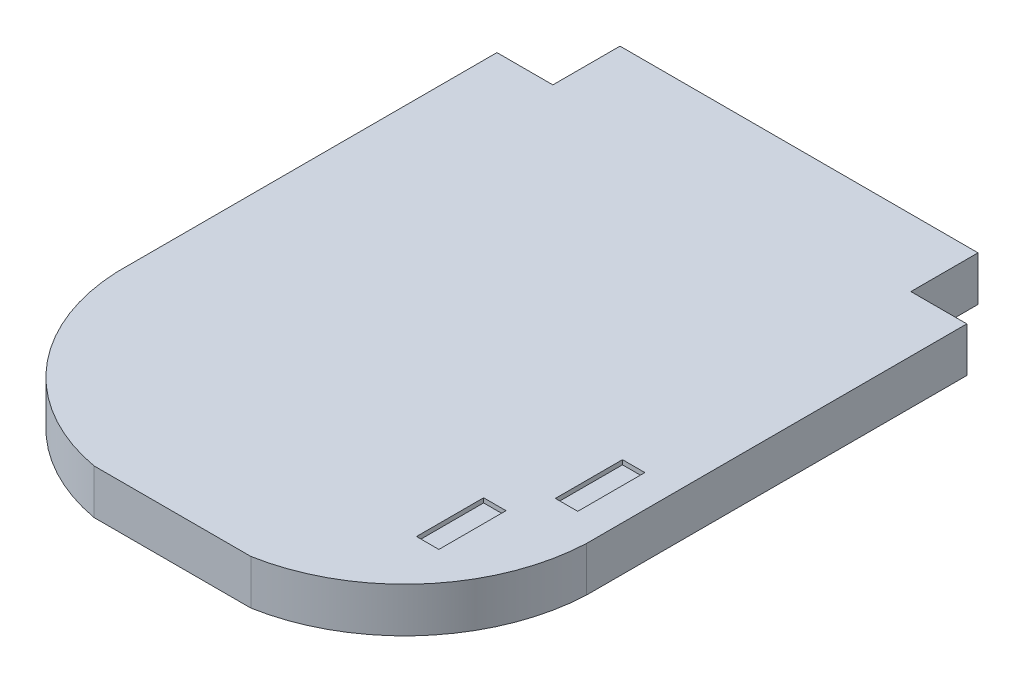
ISO-10303-21;
HEADER;
FILE_DESCRIPTION(('STEP AP214'),'2;1');
FILE_NAME('part.step','',(''),(''),'','','');
FILE_SCHEMA(('AUTOMOTIVE_DESIGN { 1 0 10303 214 1 1 1 1 }'));
ENDSEC;
DATA;
#1=APPLICATION_CONTEXT('core data for automotive mechanical design processes');
#2=APPLICATION_PROTOCOL_DEFINITION('international standard','automotive_design',2000,#1);
#3=PRODUCT_CONTEXT('',#1,'mechanical');
#4=PRODUCT('Part','Part','',(#3));
#5=PRODUCT_RELATED_PRODUCT_CATEGORY('part','',(#4));
#6=PRODUCT_DEFINITION_FORMATION('','',#4);
#7=PRODUCT_DEFINITION_CONTEXT('part definition',#1,'design');
#8=PRODUCT_DEFINITION('design','',#6,#7);
#9=PRODUCT_DEFINITION_SHAPE('','',#8);
#10=(LENGTH_UNIT() NAMED_UNIT(*) SI_UNIT(.MILLI.,.METRE.));
#11=(NAMED_UNIT(*) PLANE_ANGLE_UNIT() SI_UNIT($,.RADIAN.));
#12=(NAMED_UNIT(*) SI_UNIT($,.STERADIAN.) SOLID_ANGLE_UNIT());
#13=UNCERTAINTY_MEASURE_WITH_UNIT(LENGTH_MEASURE(1.E-05),#10,'distance_accuracy_value','');
#14=(GEOMETRIC_REPRESENTATION_CONTEXT(3) GLOBAL_UNCERTAINTY_ASSIGNED_CONTEXT((#13)) GLOBAL_UNIT_ASSIGNED_CONTEXT((#10,
#11,#12)) REPRESENTATION_CONTEXT('',''));
#15=CARTESIAN_POINT('',(0.,0.,0.));
#16=DIRECTION('',(0.,0.,1.));
#17=DIRECTION('',(1.,0.,0.));
#18=AXIS2_PLACEMENT_3D('',#15,#16,#17);
#19=CARTESIAN_POINT('',(-2.,2.,5.62499999999999));
#20=DIRECTION('',(0.,-1.,0.));
#21=DIRECTION('',(0.,0.,-1.));
#22=AXIS2_PLACEMENT_3D('',#19,#20,#21);
#23=CYLINDRICAL_SURFACE('',#22,8.50826803762082);
#24=CARTESIAN_POINT('',(-2.,0.,5.62499999999999));
#25=DIRECTION('',(0.,1.,0.));
#26=DIRECTION('',(0.,0.,1.));
#27=AXIS2_PLACEMENT_3D('',#24,#25,#26);
#28=CIRCLE('',#27,8.50826803762082);
#29=CARTESIAN_POINT('',(-10.5,0.,6.));
#30=VERTEX_POINT('',#29);
#31=CARTESIAN_POINT('',(-3.5,0.,14.));
#32=VERTEX_POINT('',#31);
#33=EDGE_CURVE('E210',#30,#32,#28,.T.);
#34=ORIENTED_EDGE('',*,*,#33,.T.);
#35=DIRECTION('',(0.,-1.,0.));
#36=VECTOR('',#35,1.);
#37=CARTESIAN_POINT('',(-3.5,2.,14.));
#38=LINE('',#37,#36);
#39=CARTESIAN_POINT('',(-3.5,2.,14.));
#40=VERTEX_POINT('',#39);
#41=EDGE_CURVE('E11',#40,#32,#38,.T.);
#42=ORIENTED_EDGE('',*,*,#41,.F.);
#43=CARTESIAN_POINT('',(-2.,2.,5.62499999999999));
#44=DIRECTION('',(0.,1.,0.));
#45=DIRECTION('',(0.,0.,1.));
#46=AXIS2_PLACEMENT_3D('',#43,#44,#45);
#47=CIRCLE('',#46,8.50826803762082);
#48=CARTESIAN_POINT('',(-10.5,2.,6.));
#49=VERTEX_POINT('',#48);
#50=EDGE_CURVE('E257',#49,#40,#47,.T.);
#51=ORIENTED_EDGE('',*,*,#50,.F.);
#52=DIRECTION('',(0.,-1.,0.));
#53=VECTOR('',#52,1.);
#54=CARTESIAN_POINT('',(-10.5,2.,6.));
#55=LINE('',#54,#53);
#56=EDGE_CURVE('E289',#49,#30,#55,.T.);
#57=ORIENTED_EDGE('',*,*,#56,.T.);
#58=EDGE_LOOP('',(#34,#42,#51,#57));
#59=FACE_BOUND('',#58,.T.);
#60=ADVANCED_FACE('F39',(#59),#23,.T.);
#61=CARTESIAN_POINT('',(-3.5,2.,14.));
#62=DIRECTION('',(0.,0.,-1.));
#63=DIRECTION('',(-1.,0.,0.));
#64=AXIS2_PLACEMENT_3D('',#61,#62,#63);
#65=PLANE('',#64);
#66=DIRECTION('',(1.,0.,0.));
#67=VECTOR('',#66,1.);
#68=CARTESIAN_POINT('',(-3.5,0.,14.));
#69=LINE('',#68,#67);
#70=CARTESIAN_POINT('',(3.5,0.,14.));
#71=VERTEX_POINT('',#70);
#72=EDGE_CURVE('E293',#32,#71,#69,.T.);
#73=ORIENTED_EDGE('',*,*,#72,.T.);
#74=DIRECTION('',(0.,-1.,0.));
#75=VECTOR('',#74,1.);
#76=CARTESIAN_POINT('',(3.5,2.,14.));
#77=LINE('',#76,#75);
#78=CARTESIAN_POINT('',(3.5,2.,14.));
#79=VERTEX_POINT('',#78);
#80=EDGE_CURVE('E47',#79,#71,#77,.T.);
#81=ORIENTED_EDGE('',*,*,#80,.F.);
#82=DIRECTION('',(1.,0.,0.));
#83=VECTOR('',#82,1.);
#84=CARTESIAN_POINT('',(-3.5,2.,14.));
#85=LINE('',#84,#83);
#86=EDGE_CURVE('E261',#40,#79,#85,.T.);
#87=ORIENTED_EDGE('',*,*,#86,.F.);
#88=ORIENTED_EDGE('',*,*,#41,.T.);
#89=EDGE_LOOP('',(#73,#81,#87,#88));
#90=FACE_BOUND('',#89,.T.);
#91=ADVANCED_FACE('F378',(#90),#65,.F.);
#92=CARTESIAN_POINT('',(2.,2.,5.62499999999999));
#93=DIRECTION('',(0.,-1.,0.));
#94=DIRECTION('',(0.,0.,-1.));
#95=AXIS2_PLACEMENT_3D('',#92,#93,#94);
#96=CYLINDRICAL_SURFACE('',#95,8.50826803762082);
#97=CARTESIAN_POINT('',(2.,0.,5.62499999999999));
#98=DIRECTION('',(0.,1.,0.));
#99=DIRECTION('',(0.,0.,-1.));
#100=AXIS2_PLACEMENT_3D('',#97,#98,#99);
#101=CIRCLE('',#100,8.50826803762082);
#102=CARTESIAN_POINT('',(10.5,0.,6.));
#103=VERTEX_POINT('',#102);
#104=EDGE_CURVE('E296',#71,#103,#101,.T.);
#105=ORIENTED_EDGE('',*,*,#104,.T.);
#106=DIRECTION('',(0.,-1.,0.));
#107=VECTOR('',#106,1.);
#108=CARTESIAN_POINT('',(10.5,2.,6.));
#109=LINE('',#108,#107);
#110=CARTESIAN_POINT('',(10.5,2.,6.));
#111=VERTEX_POINT('',#110);
#112=EDGE_CURVE('E346',#111,#103,#109,.T.);
#113=ORIENTED_EDGE('',*,*,#112,.F.);
#114=CARTESIAN_POINT('',(2.,2.,5.62499999999999));
#115=DIRECTION('',(0.,1.,0.));
#116=DIRECTION('',(0.,0.,-1.));
#117=AXIS2_PLACEMENT_3D('',#114,#115,#116);
#118=CIRCLE('',#117,8.50826803762082);
#119=EDGE_CURVE('E265',#79,#111,#118,.T.);
#120=ORIENTED_EDGE('',*,*,#119,.F.);
#121=ORIENTED_EDGE('',*,*,#80,.T.);
#122=EDGE_LOOP('',(#105,#113,#120,#121));
#123=FACE_BOUND('',#122,.T.);
#124=ADVANCED_FACE('F355',(#123),#96,.T.);
#125=CARTESIAN_POINT('',(10.5,2.,-11.));
#126=DIRECTION('',(-1.,0.,0.));
#127=DIRECTION('',(0.,0.,1.));
#128=AXIS2_PLACEMENT_3D('',#125,#126,#127);
#129=PLANE('',#128);
#130=DIRECTION('',(0.,0.,-1.));
#131=VECTOR('',#130,1.);
#132=CARTESIAN_POINT('',(10.5,0.,-11.));
#133=LINE('',#132,#131);
#134=CARTESIAN_POINT('',(10.5,0.,-11.));
#135=VERTEX_POINT('',#134);
#136=EDGE_CURVE('E299',#103,#135,#133,.T.);
#137=ORIENTED_EDGE('',*,*,#136,.T.);
#138=DIRECTION('',(0.,-1.,0.));
#139=VECTOR('',#138,1.);
#140=CARTESIAN_POINT('',(10.5,2.,-11.));
#141=LINE('',#140,#139);
#142=CARTESIAN_POINT('',(10.5,2.,-11.));
#143=VERTEX_POINT('',#142);
#144=EDGE_CURVE('E342',#143,#135,#141,.T.);
#145=ORIENTED_EDGE('',*,*,#144,.F.);
#146=DIRECTION('',(0.,0.,-1.));
#147=VECTOR('',#146,1.);
#148=CARTESIAN_POINT('',(10.5,2.,-11.));
#149=LINE('',#148,#147);
#150=EDGE_CURVE('E268',#111,#143,#149,.T.);
#151=ORIENTED_EDGE('',*,*,#150,.F.);
#152=ORIENTED_EDGE('',*,*,#112,.T.);
#153=EDGE_LOOP('',(#137,#145,#151,#152));
#154=FACE_BOUND('',#153,.T.);
#155=ADVANCED_FACE('F366',(#154),#129,.F.);
#156=CARTESIAN_POINT('',(8.,2.,-11.));
#157=DIRECTION('',(0.,0.,1.));
#158=DIRECTION('',(1.,0.,0.));
#159=AXIS2_PLACEMENT_3D('',#156,#157,#158);
#160=PLANE('',#159);
#161=DIRECTION('',(-1.,0.,0.));
#162=VECTOR('',#161,1.);
#163=CARTESIAN_POINT('',(8.,0.,-11.));
#164=LINE('',#163,#162);
#165=CARTESIAN_POINT('',(8.,0.,-11.));
#166=VERTEX_POINT('',#165);
#167=EDGE_CURVE('E302',#135,#166,#164,.T.);
#168=ORIENTED_EDGE('',*,*,#167,.T.);
#169=DIRECTION('',(0.,-1.,0.));
#170=VECTOR('',#169,1.);
#171=CARTESIAN_POINT('',(8.,2.,-11.));
#172=LINE('',#171,#170);
#173=CARTESIAN_POINT('',(8.,2.,-11.));
#174=VERTEX_POINT('',#173);
#175=EDGE_CURVE('E338',#174,#166,#172,.T.);
#176=ORIENTED_EDGE('',*,*,#175,.F.);
#177=DIRECTION('',(-1.,0.,0.));
#178=VECTOR('',#177,1.);
#179=CARTESIAN_POINT('',(8.,2.,-11.));
#180=LINE('',#179,#178);
#181=EDGE_CURVE('E271',#143,#174,#180,.T.);
#182=ORIENTED_EDGE('',*,*,#181,.F.);
#183=ORIENTED_EDGE('',*,*,#144,.T.);
#184=EDGE_LOOP('',(#168,#176,#182,#183));
#185=FACE_BOUND('',#184,.T.);
#186=ADVANCED_FACE('F370',(#185),#160,.F.);
#187=CARTESIAN_POINT('',(8.,2.,-14.));
#188=DIRECTION('',(-1.,0.,0.));
#189=DIRECTION('',(0.,0.,1.));
#190=AXIS2_PLACEMENT_3D('',#187,#188,#189);
#191=PLANE('',#190);
#192=DIRECTION('',(0.,0.,-1.));
#193=VECTOR('',#192,1.);
#194=CARTESIAN_POINT('',(8.,0.,-14.));
#195=LINE('',#194,#193);
#196=CARTESIAN_POINT('',(8.,0.,-14.));
#197=VERTEX_POINT('',#196);
#198=EDGE_CURVE('E305',#166,#197,#195,.T.);
#199=ORIENTED_EDGE('',*,*,#198,.T.);
#200=DIRECTION('',(0.,-1.,0.));
#201=VECTOR('',#200,1.);
#202=CARTESIAN_POINT('',(8.,2.,-14.));
#203=LINE('',#202,#201);
#204=CARTESIAN_POINT('',(8.,2.,-14.));
#205=VERTEX_POINT('',#204);
#206=EDGE_CURVE('E334',#205,#197,#203,.T.);
#207=ORIENTED_EDGE('',*,*,#206,.F.);
#208=DIRECTION('',(0.,0.,-1.));
#209=VECTOR('',#208,1.);
#210=CARTESIAN_POINT('',(8.,2.,-14.));
#211=LINE('',#210,#209);
#212=EDGE_CURVE('E274',#174,#205,#211,.T.);
#213=ORIENTED_EDGE('',*,*,#212,.F.);
#214=ORIENTED_EDGE('',*,*,#175,.T.);
#215=EDGE_LOOP('',(#199,#207,#213,#214));
#216=FACE_BOUND('',#215,.T.);
#217=ADVANCED_FACE('F401',(#216),#191,.F.);
#218=CARTESIAN_POINT('',(-8.,2.,-14.));
#219=DIRECTION('',(0.,0.,1.));
#220=DIRECTION('',(1.,0.,0.));
#221=AXIS2_PLACEMENT_3D('',#218,#219,#220);
#222=PLANE('',#221);
#223=DIRECTION('',(-1.,0.,0.));
#224=VECTOR('',#223,1.);
#225=CARTESIAN_POINT('',(-8.,0.,-14.));
#226=LINE('',#225,#224);
#227=CARTESIAN_POINT('',(-8.,0.,-14.));
#228=VERTEX_POINT('',#227);
#229=EDGE_CURVE('E308',#197,#228,#226,.T.);
#230=ORIENTED_EDGE('',*,*,#229,.T.);
#231=DIRECTION('',(0.,-1.,0.));
#232=VECTOR('',#231,1.);
#233=CARTESIAN_POINT('',(-8.,2.,-14.));
#234=LINE('',#233,#232);
#235=CARTESIAN_POINT('',(-8.,2.,-14.));
#236=VERTEX_POINT('',#235);
#237=EDGE_CURVE('E330',#236,#228,#234,.T.);
#238=ORIENTED_EDGE('',*,*,#237,.F.);
#239=DIRECTION('',(-1.,0.,0.));
#240=VECTOR('',#239,1.);
#241=CARTESIAN_POINT('',(-8.,2.,-14.));
#242=LINE('',#241,#240);
#243=EDGE_CURVE('E277',#205,#236,#242,.T.);
#244=ORIENTED_EDGE('',*,*,#243,.F.);
#245=ORIENTED_EDGE('',*,*,#206,.T.);
#246=EDGE_LOOP('',(#230,#238,#244,#245));
#247=FACE_BOUND('',#246,.T.);
#248=ADVANCED_FACE('F398',(#247),#222,.F.);
#249=CARTESIAN_POINT('',(-8.,2.,-14.));
#250=DIRECTION('',(1.,0.,0.));
#251=DIRECTION('',(0.,0.,-1.));
#252=AXIS2_PLACEMENT_3D('',#249,#250,#251);
#253=PLANE('',#252);
#254=DIRECTION('',(0.,0.,1.));
#255=VECTOR('',#254,1.);
#256=CARTESIAN_POINT('',(-8.,0.,-14.));
#257=LINE('',#256,#255);
#258=CARTESIAN_POINT('',(-8.,0.,-11.));
#259=VERTEX_POINT('',#258);
#260=EDGE_CURVE('E311',#228,#259,#257,.T.);
#261=ORIENTED_EDGE('',*,*,#260,.T.);
#262=DIRECTION('',(0.,-1.,0.));
#263=VECTOR('',#262,1.);
#264=CARTESIAN_POINT('',(-8.,2.,-11.));
#265=LINE('',#264,#263);
#266=CARTESIAN_POINT('',(-8.,2.,-11.));
#267=VERTEX_POINT('',#266);
#268=EDGE_CURVE('E326',#267,#259,#265,.T.);
#269=ORIENTED_EDGE('',*,*,#268,.F.);
#270=DIRECTION('',(0.,0.,1.));
#271=VECTOR('',#270,1.);
#272=CARTESIAN_POINT('',(-8.,2.,-14.));
#273=LINE('',#272,#271);
#274=EDGE_CURVE('E280',#236,#267,#273,.T.);
#275=ORIENTED_EDGE('',*,*,#274,.F.);
#276=ORIENTED_EDGE('',*,*,#237,.T.);
#277=EDGE_LOOP('',(#261,#269,#275,#276));
#278=FACE_BOUND('',#277,.T.);
#279=ADVANCED_FACE('F394',(#278),#253,.F.);
#280=CARTESIAN_POINT('',(-8.,2.,-11.));
#281=DIRECTION('',(0.,0.,1.));
#282=DIRECTION('',(1.,0.,0.));
#283=AXIS2_PLACEMENT_3D('',#280,#281,#282);
#284=PLANE('',#283);
#285=DIRECTION('',(-1.,0.,0.));
#286=VECTOR('',#285,1.);
#287=CARTESIAN_POINT('',(-8.,0.,-11.));
#288=LINE('',#287,#286);
#289=CARTESIAN_POINT('',(-10.5,0.,-11.));
#290=VERTEX_POINT('',#289);
#291=EDGE_CURVE('E314',#259,#290,#288,.T.);
#292=ORIENTED_EDGE('',*,*,#291,.T.);
#293=DIRECTION('',(0.,-1.,0.));
#294=VECTOR('',#293,1.);
#295=CARTESIAN_POINT('',(-10.5,2.,-11.));
#296=LINE('',#295,#294);
#297=CARTESIAN_POINT('',(-10.5,2.,-11.));
#298=VERTEX_POINT('',#297);
#299=EDGE_CURVE('E322',#298,#290,#296,.T.);
#300=ORIENTED_EDGE('',*,*,#299,.F.);
#301=DIRECTION('',(-1.,0.,0.));
#302=VECTOR('',#301,1.);
#303=CARTESIAN_POINT('',(-8.,2.,-11.));
#304=LINE('',#303,#302);
#305=EDGE_CURVE('E283',#267,#298,#304,.T.);
#306=ORIENTED_EDGE('',*,*,#305,.F.);
#307=ORIENTED_EDGE('',*,*,#268,.T.);
#308=EDGE_LOOP('',(#292,#300,#306,#307));
#309=FACE_BOUND('',#308,.T.);
#310=ADVANCED_FACE('F390',(#309),#284,.F.);
#311=CARTESIAN_POINT('',(-10.5,2.,-11.));
#312=DIRECTION('',(1.,0.,0.));
#313=DIRECTION('',(0.,0.,-1.));
#314=AXIS2_PLACEMENT_3D('',#311,#312,#313);
#315=PLANE('',#314);
#316=DIRECTION('',(0.,0.,1.));
#317=VECTOR('',#316,1.);
#318=CARTESIAN_POINT('',(-10.5,0.,-11.));
#319=LINE('',#318,#317);
#320=EDGE_CURVE('E262',#290,#30,#319,.T.);
#321=ORIENTED_EDGE('',*,*,#320,.T.);
#322=ORIENTED_EDGE('',*,*,#56,.F.);
#323=DIRECTION('',(0.,0.,1.));
#324=VECTOR('',#323,1.);
#325=CARTESIAN_POINT('',(-10.5,2.,-11.));
#326=LINE('',#325,#324);
#327=EDGE_CURVE('E286',#298,#49,#326,.T.);
#328=ORIENTED_EDGE('',*,*,#327,.F.);
#329=ORIENTED_EDGE('',*,*,#299,.T.);
#330=EDGE_LOOP('',(#321,#322,#328,#329));
#331=FACE_BOUND('',#330,.T.);
#332=ADVANCED_FACE('F385',(#331),#315,.F.);
#333=CARTESIAN_POINT('',(-2.,2.,5.62499999999999));
#334=DIRECTION('',(0.,1.,0.));
#335=DIRECTION('',(0.,0.,1.));
#336=AXIS2_PLACEMENT_3D('',#333,#334,#335);
#337=PLANE('',#336);
#338=DIRECTION('',(0.,0.,1.));
#339=VECTOR('',#338,1.);
#340=CARTESIAN_POINT('',(8.06143686146302,2.,1.94974286881895));
#341=LINE('',#340,#339);
#342=CARTESIAN_POINT('',(8.06143686146302,2.,1.94974286881895));
#343=VERTEX_POINT('',#342);
#344=CARTESIAN_POINT('',(8.06143686146302,2.,4.94974286881895));
#345=VERTEX_POINT('',#344);
#346=EDGE_CURVE('E54',#343,#345,#341,.T.);
#347=ORIENTED_EDGE('',*,*,#346,.F.);
#348=DIRECTION('',(-1.,0.,0.));
#349=VECTOR('',#348,1.);
#350=CARTESIAN_POINT('',(8.06143686146302,2.,1.94974286881895));
#351=LINE('',#350,#349);
#352=CARTESIAN_POINT('',(9.06143686146302,2.,1.94974286881895));
#353=VERTEX_POINT('',#352);
#354=EDGE_CURVE('E187',#353,#343,#351,.T.);
#355=ORIENTED_EDGE('',*,*,#354,.F.);
#356=DIRECTION('',(0.,0.,-1.));
#357=VECTOR('',#356,1.);
#358=CARTESIAN_POINT('',(9.06143686146302,2.,1.94974286881895));
#359=LINE('',#358,#357);
#360=CARTESIAN_POINT('',(9.06143686146302,2.,4.94974286881895));
#361=VERTEX_POINT('',#360);
#362=EDGE_CURVE('E191',#361,#353,#359,.T.);
#363=ORIENTED_EDGE('',*,*,#362,.F.);
#364=DIRECTION('',(1.,0.,0.));
#365=VECTOR('',#364,1.);
#366=CARTESIAN_POINT('',(8.06143686146302,2.,4.94974286881895));
#367=LINE('',#366,#365);
#368=EDGE_CURVE('E200',#345,#361,#367,.T.);
#369=ORIENTED_EDGE('',*,*,#368,.F.);
#370=EDGE_LOOP('',(#347,#355,#363,#369));
#371=FACE_BOUND('',#370,.T.);
#372=DIRECTION('',(0.,0.,1.));
#373=VECTOR('',#372,1.);
#374=CARTESIAN_POINT('',(6.43307632612455,2.,6.52761482316648));
#375=LINE('',#374,#373);
#376=CARTESIAN_POINT('',(6.43307632612455,2.,6.52761482316648));
#377=VERTEX_POINT('',#376);
#378=CARTESIAN_POINT('',(6.43307632612455,2.,9.52761482316648));
#379=VERTEX_POINT('',#378);
#380=EDGE_CURVE('E62',#377,#379,#375,.T.);
#381=ORIENTED_EDGE('',*,*,#380,.F.);
#382=DIRECTION('',(-1.,0.,0.));
#383=VECTOR('',#382,1.);
#384=CARTESIAN_POINT('',(6.43307632612455,2.,6.52761482316648));
#385=LINE('',#384,#383);
#386=CARTESIAN_POINT('',(7.43307632612455,2.,6.52761482316648));
#387=VERTEX_POINT('',#386);
#388=EDGE_CURVE('E221',#387,#377,#385,.T.);
#389=ORIENTED_EDGE('',*,*,#388,.F.);
#390=DIRECTION('',(0.,0.,-1.));
#391=VECTOR('',#390,1.);
#392=CARTESIAN_POINT('',(7.43307632612455,2.,6.52761482316648));
#393=LINE('',#392,#391);
#394=CARTESIAN_POINT('',(7.43307632612455,2.,9.52761482316648));
#395=VERTEX_POINT('',#394);
#396=EDGE_CURVE('E240',#395,#387,#393,.T.);
#397=ORIENTED_EDGE('',*,*,#396,.F.);
#398=DIRECTION('',(1.,0.,0.));
#399=VECTOR('',#398,1.);
#400=CARTESIAN_POINT('',(6.43307632612455,2.,9.52761482316648));
#401=LINE('',#400,#399);
#402=EDGE_CURVE('E236',#379,#395,#401,.T.);
#403=ORIENTED_EDGE('',*,*,#402,.F.);
#404=EDGE_LOOP('',(#381,#389,#397,#403));
#405=FACE_BOUND('',#404,.T.);
#406=ORIENTED_EDGE('',*,*,#50,.T.);
#407=ORIENTED_EDGE('',*,*,#86,.T.);
#408=ORIENTED_EDGE('',*,*,#119,.T.);
#409=ORIENTED_EDGE('',*,*,#150,.T.);
#410=ORIENTED_EDGE('',*,*,#181,.T.);
#411=ORIENTED_EDGE('',*,*,#212,.T.);
#412=ORIENTED_EDGE('',*,*,#243,.T.);
#413=ORIENTED_EDGE('',*,*,#274,.T.);
#414=ORIENTED_EDGE('',*,*,#305,.T.);
#415=ORIENTED_EDGE('',*,*,#327,.T.);
#416=EDGE_LOOP('',(#406,#407,#408,#409,#410,#411,#412,#413,#414,#415));
#417=FACE_BOUND('',#416,.T.);
#418=ADVANCED_FACE('F374',(#371,#405,#417),#337,.T.);
#419=CARTESIAN_POINT('',(-2.,0.,5.62499999999999));
#420=DIRECTION('',(0.,1.,0.));
#421=DIRECTION('',(0.,0.,1.));
#422=AXIS2_PLACEMENT_3D('',#419,#420,#421);
#423=PLANE('',#422);
#424=ORIENTED_EDGE('',*,*,#33,.F.);
#425=ORIENTED_EDGE('',*,*,#320,.F.);
#426=ORIENTED_EDGE('',*,*,#291,.F.);
#427=ORIENTED_EDGE('',*,*,#260,.F.);
#428=ORIENTED_EDGE('',*,*,#229,.F.);
#429=ORIENTED_EDGE('',*,*,#198,.F.);
#430=ORIENTED_EDGE('',*,*,#167,.F.);
#431=ORIENTED_EDGE('',*,*,#136,.F.);
#432=ORIENTED_EDGE('',*,*,#104,.F.);
#433=ORIENTED_EDGE('',*,*,#72,.F.);
#434=EDGE_LOOP('',(#424,#425,#426,#427,#428,#429,#430,#431,#432,#433));
#435=FACE_BOUND('',#434,.T.);
#436=ADVANCED_FACE('F361',(#435),#423,.F.);
#437=CARTESIAN_POINT('',(6.43307632612455,1.8,6.52761482316648));
#438=DIRECTION('',(-1.,0.,0.));
#439=DIRECTION('',(0.,0.,1.));
#440=AXIS2_PLACEMENT_3D('',#437,#438,#439);
#441=PLANE('',#440);
#442=ORIENTED_EDGE('',*,*,#380,.T.);
#443=DIRECTION('',(0.,1.,0.));
#444=VECTOR('',#443,1.);
#445=CARTESIAN_POINT('',(6.43307632612455,1.8,9.52761482316648));
#446=LINE('',#445,#444);
#447=CARTESIAN_POINT('',(6.43307632612455,1.8,9.52761482316648));
#448=VERTEX_POINT('',#447);
#449=EDGE_CURVE('E233',#448,#379,#446,.T.);
#450=ORIENTED_EDGE('',*,*,#449,.F.);
#451=DIRECTION('',(0.,0.,1.));
#452=VECTOR('',#451,1.);
#453=CARTESIAN_POINT('',(6.43307632612455,1.8,6.52761482316648));
#454=LINE('',#453,#452);
#455=CARTESIAN_POINT('',(6.43307632612455,1.8,6.52761482316648));
#456=VERTEX_POINT('',#455);
#457=EDGE_CURVE('E216',#456,#448,#454,.T.);
#458=ORIENTED_EDGE('',*,*,#457,.F.);
#459=DIRECTION('',(0.,1.,0.));
#460=VECTOR('',#459,1.);
#461=CARTESIAN_POINT('',(6.43307632612455,1.8,6.52761482316648));
#462=LINE('',#461,#460);
#463=EDGE_CURVE('E201',#456,#377,#462,.T.);
#464=ORIENTED_EDGE('',*,*,#463,.T.);
#465=EDGE_LOOP('',(#442,#450,#458,#464));
#466=FACE_BOUND('',#465,.T.);
#467=ADVANCED_FACE('F473',(#466),#441,.F.);
#468=CARTESIAN_POINT('',(6.43307632612455,1.8,6.52761482316648));
#469=DIRECTION('',(0.,0.,-1.));
#470=DIRECTION('',(-1.,0.,0.));
#471=AXIS2_PLACEMENT_3D('',#468,#469,#470);
#472=PLANE('',#471);
#473=ORIENTED_EDGE('',*,*,#388,.T.);
#474=ORIENTED_EDGE('',*,*,#463,.F.);
#475=DIRECTION('',(-1.,0.,0.));
#476=VECTOR('',#475,1.);
#477=CARTESIAN_POINT('',(6.43307632612455,1.8,6.52761482316648));
#478=LINE('',#477,#476);
#479=CARTESIAN_POINT('',(7.43307632612455,1.8,6.52761482316648));
#480=VERTEX_POINT('',#479);
#481=EDGE_CURVE('E229',#480,#456,#478,.T.);
#482=ORIENTED_EDGE('',*,*,#481,.F.);
#483=DIRECTION('',(0.,1.,0.));
#484=VECTOR('',#483,1.);
#485=CARTESIAN_POINT('',(7.43307632612455,1.8,6.52761482316648));
#486=LINE('',#485,#484);
#487=EDGE_CURVE('E249',#480,#387,#486,.T.);
#488=ORIENTED_EDGE('',*,*,#487,.T.);
#489=EDGE_LOOP('',(#473,#474,#482,#488));
#490=FACE_BOUND('',#489,.T.);
#491=ADVANCED_FACE('F489',(#490),#472,.F.);
#492=CARTESIAN_POINT('',(7.43307632612455,1.8,6.52761482316648));
#493=DIRECTION('',(1.,0.,0.));
#494=DIRECTION('',(0.,0.,-1.));
#495=AXIS2_PLACEMENT_3D('',#492,#493,#494);
#496=PLANE('',#495);
#497=ORIENTED_EDGE('',*,*,#396,.T.);
#498=ORIENTED_EDGE('',*,*,#487,.F.);
#499=DIRECTION('',(0.,0.,-1.));
#500=VECTOR('',#499,1.);
#501=CARTESIAN_POINT('',(7.43307632612455,1.8,6.52761482316648));
#502=LINE('',#501,#500);
#503=CARTESIAN_POINT('',(7.43307632612455,1.8,9.52761482316648));
#504=VERTEX_POINT('',#503);
#505=EDGE_CURVE('E225',#504,#480,#502,.T.);
#506=ORIENTED_EDGE('',*,*,#505,.F.);
#507=DIRECTION('',(0.,1.,0.));
#508=VECTOR('',#507,1.);
#509=CARTESIAN_POINT('',(7.43307632612455,1.8,9.52761482316648));
#510=LINE('',#509,#508);
#511=EDGE_CURVE('E252',#504,#395,#510,.T.);
#512=ORIENTED_EDGE('',*,*,#511,.T.);
#513=EDGE_LOOP('',(#497,#498,#506,#512));
#514=FACE_BOUND('',#513,.T.);
#515=ADVANCED_FACE('F498',(#514),#496,.F.);
#516=CARTESIAN_POINT('',(6.43307632612455,1.8,9.52761482316648));
#517=DIRECTION('',(0.,0.,1.));
#518=DIRECTION('',(1.,0.,0.));
#519=AXIS2_PLACEMENT_3D('',#516,#517,#518);
#520=PLANE('',#519);
#521=ORIENTED_EDGE('',*,*,#402,.T.);
#522=ORIENTED_EDGE('',*,*,#511,.F.);
#523=DIRECTION('',(1.,0.,0.));
#524=VECTOR('',#523,1.);
#525=CARTESIAN_POINT('',(6.43307632612455,1.8,9.52761482316648));
#526=LINE('',#525,#524);
#527=EDGE_CURVE('E220',#448,#504,#526,.T.);
#528=ORIENTED_EDGE('',*,*,#527,.F.);
#529=ORIENTED_EDGE('',*,*,#449,.T.);
#530=EDGE_LOOP('',(#521,#522,#528,#529));
#531=FACE_BOUND('',#530,.T.);
#532=ADVANCED_FACE('F508',(#531),#520,.F.);
#533=CARTESIAN_POINT('',(0.,1.8,0.));
#534=DIRECTION('',(0.,1.,0.));
#535=DIRECTION('',(0.,0.,1.));
#536=AXIS2_PLACEMENT_3D('',#533,#534,#535);
#537=PLANE('',#536);
#538=ORIENTED_EDGE('',*,*,#457,.T.);
#539=ORIENTED_EDGE('',*,*,#527,.T.);
#540=ORIENTED_EDGE('',*,*,#505,.T.);
#541=ORIENTED_EDGE('',*,*,#481,.T.);
#542=EDGE_LOOP('',(#538,#539,#540,#541));
#543=FACE_BOUND('',#542,.T.);
#544=ADVANCED_FACE('F518',(#543),#537,.T.);
#545=CARTESIAN_POINT('',(8.06143686146302,1.8,1.94974286881895));
#546=DIRECTION('',(-1.,0.,0.));
#547=DIRECTION('',(0.,0.,1.));
#548=AXIS2_PLACEMENT_3D('',#545,#546,#547);
#549=PLANE('',#548);
#550=ORIENTED_EDGE('',*,*,#346,.T.);
#551=DIRECTION('',(0.,1.,0.));
#552=VECTOR('',#551,1.);
#553=CARTESIAN_POINT('',(8.06143686146302,1.8,4.94974286881895));
#554=LINE('',#553,#552);
#555=CARTESIAN_POINT('',(8.06143686146302,1.8,4.94974286881895));
#556=VERTEX_POINT('',#555);
#557=EDGE_CURVE('E162',#556,#345,#554,.T.);
#558=ORIENTED_EDGE('',*,*,#557,.F.);
#559=DIRECTION('',(0.,0.,1.));
#560=VECTOR('',#559,1.);
#561=CARTESIAN_POINT('',(8.06143686146302,1.8,1.94974286881895));
#562=LINE('',#561,#560);
#563=CARTESIAN_POINT('',(8.06143686146302,1.8,1.94974286881895));
#564=VERTEX_POINT('',#563);
#565=EDGE_CURVE('E166',#564,#556,#562,.T.);
#566=ORIENTED_EDGE('',*,*,#565,.F.);
#567=DIRECTION('',(0.,1.,0.));
#568=VECTOR('',#567,1.);
#569=CARTESIAN_POINT('',(8.06143686146302,1.8,1.94974286881895));
#570=LINE('',#569,#568);
#571=EDGE_CURVE('E207',#564,#343,#570,.T.);
#572=ORIENTED_EDGE('',*,*,#571,.T.);
#573=EDGE_LOOP('',(#550,#558,#566,#572));
#574=FACE_BOUND('',#573,.T.);
#575=ADVANCED_FACE('F164',(#574),#549,.F.);
#576=CARTESIAN_POINT('',(8.06143686146302,1.8,1.94974286881895));
#577=DIRECTION('',(0.,0.,-1.));
#578=DIRECTION('',(-1.,0.,0.));
#579=AXIS2_PLACEMENT_3D('',#576,#577,#578);
#580=PLANE('',#579);
#581=ORIENTED_EDGE('',*,*,#354,.T.);
#582=ORIENTED_EDGE('',*,*,#571,.F.);
#583=DIRECTION('',(-1.,0.,0.));
#584=VECTOR('',#583,1.);
#585=CARTESIAN_POINT('',(8.06143686146302,1.8,1.94974286881895));
#586=LINE('',#585,#584);
#587=CARTESIAN_POINT('',(9.06143686146302,1.8,1.94974286881895));
#588=VERTEX_POINT('',#587);
#589=EDGE_CURVE('E173',#588,#564,#586,.T.);
#590=ORIENTED_EDGE('',*,*,#589,.F.);
#591=DIRECTION('',(0.,1.,0.));
#592=VECTOR('',#591,1.);
#593=CARTESIAN_POINT('',(9.06143686146302,1.8,1.94974286881895));
#594=LINE('',#593,#592);
#595=EDGE_CURVE('E211',#588,#353,#594,.T.);
#596=ORIENTED_EDGE('',*,*,#595,.T.);
#597=EDGE_LOOP('',(#581,#582,#590,#596));
#598=FACE_BOUND('',#597,.T.);
#599=ADVANCED_FACE('F537',(#598),#580,.F.);
#600=CARTESIAN_POINT('',(9.06143686146302,1.8,1.94974286881895));
#601=DIRECTION('',(1.,0.,0.));
#602=DIRECTION('',(0.,0.,-1.));
#603=AXIS2_PLACEMENT_3D('',#600,#601,#602);
#604=PLANE('',#603);
#605=ORIENTED_EDGE('',*,*,#362,.T.);
#606=ORIENTED_EDGE('',*,*,#595,.F.);
#607=DIRECTION('',(0.,0.,-1.));
#608=VECTOR('',#607,1.);
#609=CARTESIAN_POINT('',(9.06143686146302,1.8,1.94974286881895));
#610=LINE('',#609,#608);
#611=CARTESIAN_POINT('',(9.06143686146302,1.8,4.94974286881895));
#612=VERTEX_POINT('',#611);
#613=EDGE_CURVE('E182',#612,#588,#610,.T.);
#614=ORIENTED_EDGE('',*,*,#613,.F.);
#615=DIRECTION('',(0.,1.,0.));
#616=VECTOR('',#615,1.);
#617=CARTESIAN_POINT('',(9.06143686146302,1.8,4.94974286881895));
#618=LINE('',#617,#616);
#619=EDGE_CURVE('E172',#612,#361,#618,.T.);
#620=ORIENTED_EDGE('',*,*,#619,.T.);
#621=EDGE_LOOP('',(#605,#606,#614,#620));
#622=FACE_BOUND('',#621,.T.);
#623=ADVANCED_FACE('F546',(#622),#604,.F.);
#624=CARTESIAN_POINT('',(8.06143686146302,1.8,4.94974286881895));
#625=DIRECTION('',(0.,0.,1.));
#626=DIRECTION('',(1.,0.,0.));
#627=AXIS2_PLACEMENT_3D('',#624,#625,#626);
#628=PLANE('',#627);
#629=ORIENTED_EDGE('',*,*,#368,.T.);
#630=ORIENTED_EDGE('',*,*,#619,.F.);
#631=DIRECTION('',(1.,0.,0.));
#632=VECTOR('',#631,1.);
#633=CARTESIAN_POINT('',(8.06143686146302,1.8,4.94974286881895));
#634=LINE('',#633,#632);
#635=EDGE_CURVE('E176',#556,#612,#634,.T.);
#636=ORIENTED_EDGE('',*,*,#635,.F.);
#637=ORIENTED_EDGE('',*,*,#557,.T.);
#638=EDGE_LOOP('',(#629,#630,#636,#637));
#639=FACE_BOUND('',#638,.T.);
#640=ADVANCED_FACE('F177',(#639),#628,.F.);
#641=CARTESIAN_POINT('',(0.,1.8,0.));
#642=DIRECTION('',(0.,1.,0.));
#643=DIRECTION('',(0.,0.,1.));
#644=AXIS2_PLACEMENT_3D('',#641,#642,#643);
#645=PLANE('',#644);
#646=ORIENTED_EDGE('',*,*,#565,.T.);
#647=ORIENTED_EDGE('',*,*,#635,.T.);
#648=ORIENTED_EDGE('',*,*,#613,.T.);
#649=ORIENTED_EDGE('',*,*,#589,.T.);
#650=EDGE_LOOP('',(#646,#647,#648,#649));
#651=FACE_BOUND('',#650,.T.);
#652=ADVANCED_FACE('F184',(#651),#645,.T.);
#653=CLOSED_SHELL('',(#60,#91,#124,#155,#186,#217,#248,#279,#310,#332,#418,#436,#467,#491,#515,
#532,#544,#575,#599,#623,#640,#652));
#654=MANIFOLD_SOLID_BREP('B2',#653);
#655=ADVANCED_BREP_SHAPE_REPRESENTATION('',(#18,#654),#14);
#656=SHAPE_DEFINITION_REPRESENTATION(#9,#655);
ENDSEC;
END-ISO-10303-21;
